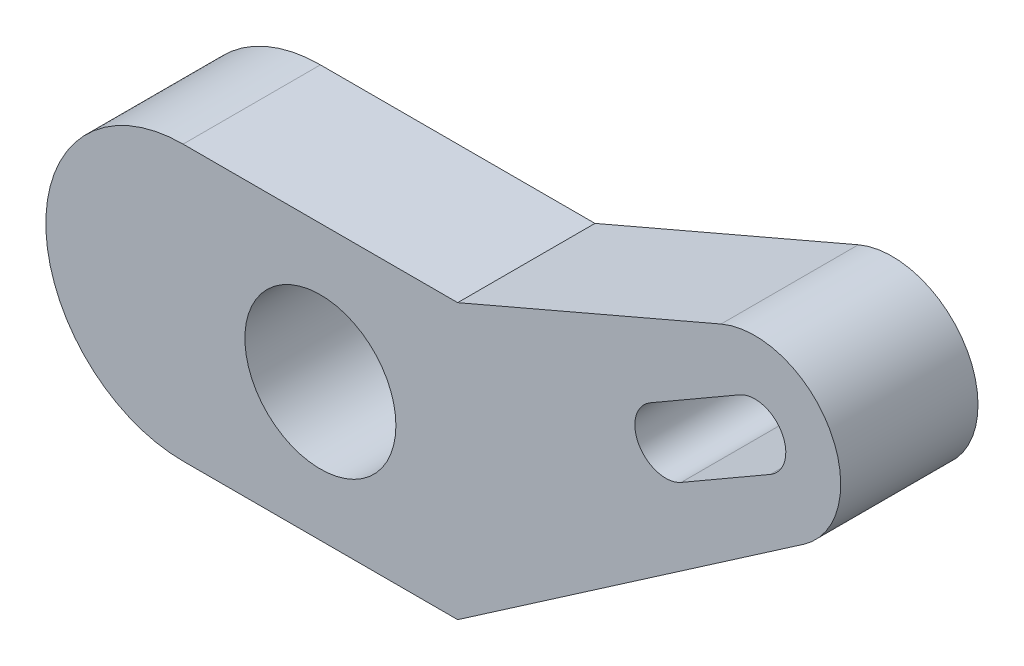
ISO-10303-21;
HEADER;
FILE_DESCRIPTION(('STEP AP214'),'2;1');
FILE_NAME('part.step','',(''),(''),'','','');
FILE_SCHEMA(('AUTOMOTIVE_DESIGN { 1 0 10303 214 1 1 1 1 }'));
ENDSEC;
DATA;
#1=APPLICATION_CONTEXT('core data for automotive mechanical design processes');
#2=APPLICATION_PROTOCOL_DEFINITION('international standard','automotive_design',2000,#1);
#3=PRODUCT_CONTEXT('',#1,'mechanical');
#4=PRODUCT('Part','Part','',(#3));
#5=PRODUCT_RELATED_PRODUCT_CATEGORY('part','',(#4));
#6=PRODUCT_DEFINITION_FORMATION('','',#4);
#7=PRODUCT_DEFINITION_CONTEXT('part definition',#1,'design');
#8=PRODUCT_DEFINITION('design','',#6,#7);
#9=PRODUCT_DEFINITION_SHAPE('','',#8);
#10=(LENGTH_UNIT() NAMED_UNIT(*) SI_UNIT(.MILLI.,.METRE.));
#11=(NAMED_UNIT(*) PLANE_ANGLE_UNIT() SI_UNIT($,.RADIAN.));
#12=(NAMED_UNIT(*) SI_UNIT($,.STERADIAN.) SOLID_ANGLE_UNIT());
#13=UNCERTAINTY_MEASURE_WITH_UNIT(LENGTH_MEASURE(1.E-05),#10,'distance_accuracy_value','');
#14=(GEOMETRIC_REPRESENTATION_CONTEXT(3) GLOBAL_UNCERTAINTY_ASSIGNED_CONTEXT((#13)) GLOBAL_UNIT_ASSIGNED_CONTEXT((#10,
#11,#12)) REPRESENTATION_CONTEXT('',''));
#15=CARTESIAN_POINT('',(0.,0.,0.));
#16=DIRECTION('',(0.,0.,1.));
#17=DIRECTION('',(1.,0.,0.));
#18=AXIS2_PLACEMENT_3D('',#15,#16,#17);
#19=CARTESIAN_POINT('',(0.,20.,20.));
#20=DIRECTION('',(0.,1.,0.));
#21=DIRECTION('',(-1.,0.,0.));
#22=AXIS2_PLACEMENT_3D('',#19,#20,#21);
#23=PLANE('',#22);
#24=DIRECTION('',(1.,0.,0.));
#25=VECTOR('',#24,1.);
#26=CARTESIAN_POINT('',(0.,20.,0.));
#27=LINE('',#26,#25);
#28=CARTESIAN_POINT('',(0.,20.,0.));
#29=VERTEX_POINT('',#28);
#30=CARTESIAN_POINT('',(40.,20.,0.));
#31=VERTEX_POINT('',#30);
#32=EDGE_CURVE('E176',#29,#31,#27,.T.);
#33=ORIENTED_EDGE('',*,*,#32,.F.);
#34=DIRECTION('',(0.,0.,-1.));
#35=VECTOR('',#34,1.);
#36=CARTESIAN_POINT('',(0.,20.,20.));
#37=LINE('',#36,#35);
#38=CARTESIAN_POINT('',(0.,20.,20.));
#39=VERTEX_POINT('',#38);
#40=EDGE_CURVE('E44',#39,#29,#37,.T.);
#41=ORIENTED_EDGE('',*,*,#40,.F.);
#42=DIRECTION('',(1.,0.,0.));
#43=VECTOR('',#42,1.);
#44=CARTESIAN_POINT('',(0.,20.,20.));
#45=LINE('',#44,#43);
#46=CARTESIAN_POINT('',(40.,20.,20.));
#47=VERTEX_POINT('',#46);
#48=EDGE_CURVE('E177',#39,#47,#45,.T.);
#49=ORIENTED_EDGE('',*,*,#48,.T.);
#50=DIRECTION('',(0.,0.,-1.));
#51=VECTOR('',#50,1.);
#52=CARTESIAN_POINT('',(40.,20.,20.));
#53=LINE('',#52,#51);
#54=EDGE_CURVE('E11',#47,#31,#53,.T.);
#55=ORIENTED_EDGE('',*,*,#54,.T.);
#56=EDGE_LOOP('',(#33,#41,#49,#55));
#57=FACE_BOUND('',#56,.T.);
#58=ADVANCED_FACE('F37',(#57),#23,.T.);
#59=CARTESIAN_POINT('',(0.,0.,20.));
#60=DIRECTION('',(0.,0.,-1.));
#61=DIRECTION('',(-1.,0.,0.));
#62=AXIS2_PLACEMENT_3D('',#59,#60,#61);
#63=CYLINDRICAL_SURFACE('',#62,20.);
#64=CARTESIAN_POINT('',(0.,0.,0.));
#65=DIRECTION('',(0.,0.,1.));
#66=DIRECTION('',(1.,0.,0.));
#67=AXIS2_PLACEMENT_3D('',#64,#65,#66);
#68=CIRCLE('',#67,20.);
#69=CARTESIAN_POINT('',(0.,-20.,0.));
#70=VERTEX_POINT('',#69);
#71=EDGE_CURVE('E187',#29,#70,#68,.T.);
#72=ORIENTED_EDGE('',*,*,#71,.T.);
#73=DIRECTION('',(0.,0.,-1.));
#74=VECTOR('',#73,1.);
#75=CARTESIAN_POINT('',(0.,-20.,20.));
#76=LINE('',#75,#74);
#77=CARTESIAN_POINT('',(0.,-20.,20.));
#78=VERTEX_POINT('',#77);
#79=EDGE_CURVE('E192',#78,#70,#76,.T.);
#80=ORIENTED_EDGE('',*,*,#79,.F.);
#81=CARTESIAN_POINT('',(0.,0.,20.));
#82=DIRECTION('',(0.,0.,1.));
#83=DIRECTION('',(1.,0.,0.));
#84=AXIS2_PLACEMENT_3D('',#81,#82,#83);
#85=CIRCLE('',#84,20.);
#86=EDGE_CURVE('E179',#39,#78,#85,.T.);
#87=ORIENTED_EDGE('',*,*,#86,.F.);
#88=ORIENTED_EDGE('',*,*,#40,.T.);
#89=EDGE_LOOP('',(#72,#80,#87,#88));
#90=FACE_BOUND('',#89,.T.);
#91=ADVANCED_FACE('F197',(#90),#63,.T.);
#92=CARTESIAN_POINT('',(0.,-20.,20.));
#93=DIRECTION('',(0.,1.,0.));
#94=DIRECTION('',(-1.,0.,0.));
#95=AXIS2_PLACEMENT_3D('',#92,#93,#94);
#96=PLANE('',#95);
#97=DIRECTION('',(1.,0.,0.));
#98=VECTOR('',#97,1.);
#99=CARTESIAN_POINT('',(0.,-20.,0.));
#100=LINE('',#99,#98);
#101=CARTESIAN_POINT('',(40.,-20.,0.));
#102=VERTEX_POINT('',#101);
#103=EDGE_CURVE('E180',#70,#102,#100,.T.);
#104=ORIENTED_EDGE('',*,*,#103,.T.);
#105=DIRECTION('',(0.,0.,-1.));
#106=VECTOR('',#105,1.);
#107=CARTESIAN_POINT('',(40.,-20.,20.));
#108=LINE('',#107,#106);
#109=CARTESIAN_POINT('',(40.,-20.,20.));
#110=VERTEX_POINT('',#109);
#111=EDGE_CURVE('E184',#110,#102,#108,.T.);
#112=ORIENTED_EDGE('',*,*,#111,.F.);
#113=DIRECTION('',(1.,0.,0.));
#114=VECTOR('',#113,1.);
#115=CARTESIAN_POINT('',(0.,-20.,20.));
#116=LINE('',#115,#114);
#117=EDGE_CURVE('E182',#78,#110,#116,.T.);
#118=ORIENTED_EDGE('',*,*,#117,.F.);
#119=ORIENTED_EDGE('',*,*,#79,.T.);
#120=EDGE_LOOP('',(#104,#112,#118,#119));
#121=FACE_BOUND('',#120,.T.);
#122=ADVANCED_FACE('F220',(#121),#96,.F.);
#123=CARTESIAN_POINT('',(0.,0.,20.));
#124=DIRECTION('',(0.,0.,1.));
#125=DIRECTION('',(1.,0.,0.));
#126=AXIS2_PLACEMENT_3D('',#123,#124,#125);
#127=PLANE('',#126);
#128=DIRECTION('',(-0.866025403784438,-0.500000000000002,0.));
#129=VECTOR('',#128,1.);
#130=CARTESIAN_POINT('',(7.75000000000006,-13.4233937586589,20.));
#131=LINE('',#130,#129);
#132=CARTESIAN_POINT('',(81.0512701892219,28.89711431703,20.));
#133=VERTEX_POINT('',#132);
#134=CARTESIAN_POINT('',(68.0608891324553,21.39711431703,20.));
#135=VERTEX_POINT('',#134);
#136=EDGE_CURVE('E51',#133,#135,#131,.T.);
#137=ORIENTED_EDGE('',*,*,#136,.F.);
#138=CARTESIAN_POINT('',(83.3012701892219,25.0000000000001,20.));
#139=DIRECTION('',(0.,0.,1.));
#140=DIRECTION('',(1.,0.,0.));
#141=AXIS2_PLACEMENT_3D('',#138,#139,#140);
#142=CIRCLE('',#141,4.5);
#143=CARTESIAN_POINT('',(85.5512701892219,21.1028856829701,20.));
#144=VERTEX_POINT('',#143);
#145=EDGE_CURVE('E130',#144,#133,#142,.T.);
#146=ORIENTED_EDGE('',*,*,#145,.F.);
#147=DIRECTION('',(0.866025403784438,0.5,0.));
#148=VECTOR('',#147,1.);
#149=CARTESIAN_POINT('',(12.25,-21.2176223927187,20.));
#150=LINE('',#149,#148);
#151=CARTESIAN_POINT('',(72.5608891324553,13.6028856829701,20.));
#152=VERTEX_POINT('',#151);
#153=EDGE_CURVE('E133',#152,#144,#150,.T.);
#154=ORIENTED_EDGE('',*,*,#153,.F.);
#155=CARTESIAN_POINT('',(70.3108891324553,17.5000000000001,20.));
#156=DIRECTION('',(0.,0.,1.));
#157=DIRECTION('',(1.,0.,0.));
#158=AXIS2_PLACEMENT_3D('',#155,#156,#157);
#159=CIRCLE('',#158,4.5);
#160=EDGE_CURVE('E139',#135,#152,#159,.T.);
#161=ORIENTED_EDGE('',*,*,#160,.F.);
#162=EDGE_LOOP('',(#137,#146,#154,#161));
#163=FACE_BOUND('',#162,.T.);
#164=CARTESIAN_POINT('',(20.,0.,20.));
#165=DIRECTION('',(0.,0.,1.));
#166=DIRECTION('',(1.,0.,0.));
#167=AXIS2_PLACEMENT_3D('',#164,#165,#166);
#168=CIRCLE('',#167,11.);
#169=CARTESIAN_POINT('',(31.,0.,20.));
#170=VERTEX_POINT('',#169);
#171=EDGE_CURVE('E145',#170,#170,#168,.T.);
#172=ORIENTED_EDGE('',*,*,#171,.F.);
#173=EDGE_LOOP('',(#172));
#174=FACE_BOUND('',#173,.T.);
#175=ORIENTED_EDGE('',*,*,#117,.T.);
#176=DIRECTION('',(0.823574307507263,0.56720839205175,0.));
#177=VECTOR('',#176,1.);
#178=CARTESIAN_POINT('',(22.2117795744838,-32.2510231475745,20.));
#179=LINE('',#178,#177);
#180=CARTESIAN_POINT('',(90.3913750898688,14.7053211561593,20.));
#181=VERTEX_POINT('',#180);
#182=EDGE_CURVE('E155',#110,#181,#179,.T.);
#183=ORIENTED_EDGE('',*,*,#182,.T.);
#184=CARTESIAN_POINT('',(83.3012701892219,25.0000000000001,20.));
#185=DIRECTION('',(0.,0.,1.));
#186=DIRECTION('',(1.,0.,0.));
#187=AXIS2_PLACEMENT_3D('',#184,#185,#186);
#188=CIRCLE('',#187,12.5);
#189=CARTESIAN_POINT('',(78.3666843933574,36.4847665637249,20.));
#190=VERTEX_POINT('',#189);
#191=EDGE_CURVE('E158',#181,#190,#188,.T.);
#192=ORIENTED_EDGE('',*,*,#191,.T.);
#193=DIRECTION('',(-0.918781325097988,-0.394766863669159,0.));
#194=VECTOR('',#193,1.);
#195=CARTESIAN_POINT('',(-1.02045337608716,2.37500558270723,20.));
#196=LINE('',#195,#194);
#197=EDGE_CURVE('E161',#190,#47,#196,.T.);
#198=ORIENTED_EDGE('',*,*,#197,.T.);
#199=ORIENTED_EDGE('',*,*,#48,.F.);
#200=ORIENTED_EDGE('',*,*,#86,.T.);
#201=EDGE_LOOP('',(#175,#183,#192,#198,#199,#200));
#202=FACE_BOUND('',#201,.T.);
#203=ADVANCED_FACE('F222',(#163,#174,#202),#127,.T.);
#204=CARTESIAN_POINT('',(0.,0.,0.));
#205=DIRECTION('',(0.,0.,1.));
#206=DIRECTION('',(1.,0.,0.));
#207=AXIS2_PLACEMENT_3D('',#204,#205,#206);
#208=PLANE('',#207);
#209=CARTESIAN_POINT('',(83.3012701892219,25.0000000000001,0.));
#210=DIRECTION('',(0.,0.,1.));
#211=DIRECTION('',(1.,0.,0.));
#212=AXIS2_PLACEMENT_3D('',#209,#210,#211);
#213=CIRCLE('',#212,4.5);
#214=CARTESIAN_POINT('',(85.5512701892219,21.1028856829701,0.));
#215=VERTEX_POINT('',#214);
#216=CARTESIAN_POINT('',(81.0512701892219,28.89711431703,0.));
#217=VERTEX_POINT('',#216);
#218=EDGE_CURVE('E120',#215,#217,#213,.T.);
#219=ORIENTED_EDGE('',*,*,#218,.T.);
#220=DIRECTION('',(-0.866025403784438,-0.500000000000002,0.));
#221=VECTOR('',#220,1.);
#222=CARTESIAN_POINT('',(7.75000000000006,-13.4233937586589,0.));
#223=LINE('',#222,#221);
#224=CARTESIAN_POINT('',(68.0608891324553,21.39711431703,0.));
#225=VERTEX_POINT('',#224);
#226=EDGE_CURVE('E114',#217,#225,#223,.T.);
#227=ORIENTED_EDGE('',*,*,#226,.T.);
#228=CARTESIAN_POINT('',(70.3108891324553,17.5000000000001,0.));
#229=DIRECTION('',(0.,0.,1.));
#230=DIRECTION('',(1.,0.,0.));
#231=AXIS2_PLACEMENT_3D('',#228,#229,#230);
#232=CIRCLE('',#231,4.5);
#233=CARTESIAN_POINT('',(72.5608891324553,13.6028856829701,0.));
#234=VERTEX_POINT('',#233);
#235=EDGE_CURVE('E123',#225,#234,#232,.T.);
#236=ORIENTED_EDGE('',*,*,#235,.T.);
#237=DIRECTION('',(0.866025403784438,0.5,0.));
#238=VECTOR('',#237,1.);
#239=CARTESIAN_POINT('',(12.25,-21.2176223927187,0.));
#240=LINE('',#239,#238);
#241=EDGE_CURVE('E59',#234,#215,#240,.T.);
#242=ORIENTED_EDGE('',*,*,#241,.T.);
#243=EDGE_LOOP('',(#219,#227,#236,#242));
#244=FACE_BOUND('',#243,.T.);
#245=CARTESIAN_POINT('',(20.,0.,0.));
#246=DIRECTION('',(0.,0.,1.));
#247=DIRECTION('',(1.,0.,0.));
#248=AXIS2_PLACEMENT_3D('',#245,#246,#247);
#249=CIRCLE('',#248,11.);
#250=CARTESIAN_POINT('',(31.,0.,0.));
#251=VERTEX_POINT('',#250);
#252=EDGE_CURVE('E149',#251,#251,#249,.T.);
#253=ORIENTED_EDGE('',*,*,#252,.T.);
#254=EDGE_LOOP('',(#253));
#255=FACE_BOUND('',#254,.T.);
#256=ORIENTED_EDGE('',*,*,#32,.T.);
#257=DIRECTION('',(-0.918781325097988,-0.394766863669159,0.));
#258=VECTOR('',#257,1.);
#259=CARTESIAN_POINT('',(-1.02045337608716,2.37500558270723,0.));
#260=LINE('',#259,#258);
#261=CARTESIAN_POINT('',(78.3666843933574,36.4847665637249,0.));
#262=VERTEX_POINT('',#261);
#263=EDGE_CURVE('E159',#262,#31,#260,.T.);
#264=ORIENTED_EDGE('',*,*,#263,.F.);
#265=CARTESIAN_POINT('',(83.3012701892219,25.0000000000001,0.));
#266=DIRECTION('',(0.,0.,1.));
#267=DIRECTION('',(1.,0.,0.));
#268=AXIS2_PLACEMENT_3D('',#265,#266,#267);
#269=CIRCLE('',#268,12.5);
#270=CARTESIAN_POINT('',(90.3913750898688,14.7053211561593,0.));
#271=VERTEX_POINT('',#270);
#272=EDGE_CURVE('E167',#271,#262,#269,.T.);
#273=ORIENTED_EDGE('',*,*,#272,.F.);
#274=DIRECTION('',(0.823574307507263,0.56720839205175,0.));
#275=VECTOR('',#274,1.);
#276=CARTESIAN_POINT('',(22.2117795744838,-32.2510231475745,0.));
#277=LINE('',#276,#275);
#278=EDGE_CURVE('E152',#102,#271,#277,.T.);
#279=ORIENTED_EDGE('',*,*,#278,.F.);
#280=ORIENTED_EDGE('',*,*,#103,.F.);
#281=ORIENTED_EDGE('',*,*,#71,.F.);
#282=EDGE_LOOP('',(#256,#264,#273,#279,#280,#281));
#283=FACE_BOUND('',#282,.T.);
#284=ADVANCED_FACE('F127',(#244,#255,#283),#208,.F.);
#285=CARTESIAN_POINT('',(22.2117795744838,-32.2510231475745,20.));
#286=DIRECTION('',(-0.56720839205175,0.823574307507263,0.));
#287=DIRECTION('',(-0.823574307507263,-0.56720839205175,0.));
#288=AXIS2_PLACEMENT_3D('',#285,#286,#287);
#289=PLANE('',#288);
#290=ORIENTED_EDGE('',*,*,#278,.T.);
#291=DIRECTION('',(0.,0.,-1.));
#292=VECTOR('',#291,1.);
#293=CARTESIAN_POINT('',(90.3913750898688,14.7053211561593,20.));
#294=LINE('',#293,#292);
#295=EDGE_CURVE('E173',#181,#271,#294,.T.);
#296=ORIENTED_EDGE('',*,*,#295,.F.);
#297=ORIENTED_EDGE('',*,*,#182,.F.);
#298=ORIENTED_EDGE('',*,*,#111,.T.);
#299=EDGE_LOOP('',(#290,#296,#297,#298));
#300=FACE_BOUND('',#299,.T.);
#301=ADVANCED_FACE('F216',(#300),#289,.F.);
#302=CARTESIAN_POINT('',(83.3012701892219,25.0000000000001,20.));
#303=DIRECTION('',(0.,0.,-1.));
#304=DIRECTION('',(-1.,0.,0.));
#305=AXIS2_PLACEMENT_3D('',#302,#303,#304);
#306=CYLINDRICAL_SURFACE('',#305,12.5);
#307=ORIENTED_EDGE('',*,*,#272,.T.);
#308=DIRECTION('',(0.,0.,-1.));
#309=VECTOR('',#308,1.);
#310=CARTESIAN_POINT('',(78.3666843933574,36.4847665637249,20.));
#311=LINE('',#310,#309);
#312=EDGE_CURVE('E164',#190,#262,#311,.T.);
#313=ORIENTED_EDGE('',*,*,#312,.F.);
#314=ORIENTED_EDGE('',*,*,#191,.F.);
#315=ORIENTED_EDGE('',*,*,#295,.T.);
#316=EDGE_LOOP('',(#307,#313,#314,#315));
#317=FACE_BOUND('',#316,.T.);
#318=ADVANCED_FACE('F213',(#317),#306,.T.);
#319=CARTESIAN_POINT('',(-1.02045337608716,2.37500558270723,20.));
#320=DIRECTION('',(0.394766863669159,-0.918781325097988,0.));
#321=DIRECTION('',(0.918781325097988,0.394766863669159,0.));
#322=AXIS2_PLACEMENT_3D('',#319,#320,#321);
#323=PLANE('',#322);
#324=ORIENTED_EDGE('',*,*,#263,.T.);
#325=ORIENTED_EDGE('',*,*,#54,.F.);
#326=ORIENTED_EDGE('',*,*,#197,.F.);
#327=ORIENTED_EDGE('',*,*,#312,.T.);
#328=EDGE_LOOP('',(#324,#325,#326,#327));
#329=FACE_BOUND('',#328,.T.);
#330=ADVANCED_FACE('F209',(#329),#323,.F.);
#331=CARTESIAN_POINT('',(20.,0.,0.));
#332=DIRECTION('',(0.,0.,1.));
#333=DIRECTION('',(1.,0.,0.));
#334=AXIS2_PLACEMENT_3D('',#331,#332,#333);
#335=CYLINDRICAL_SURFACE('',#334,11.);
#336=ORIENTED_EDGE('',*,*,#252,.F.);
#337=EDGE_LOOP('',(#336));
#338=FACE_BOUND('',#337,.T.);
#339=ORIENTED_EDGE('',*,*,#171,.T.);
#340=EDGE_LOOP('',(#339));
#341=FACE_BOUND('',#340,.T.);
#342=ADVANCED_FACE('F271',(#338,#341),#335,.F.);
#343=CARTESIAN_POINT('',(7.75000000000006,-13.4233937586589,0.));
#344=DIRECTION('',(-0.500000000000002,0.866025403784438,0.));
#345=DIRECTION('',(-0.866025403784438,-0.500000000000002,0.));
#346=AXIS2_PLACEMENT_3D('',#343,#344,#345);
#347=PLANE('',#346);
#348=ORIENTED_EDGE('',*,*,#136,.T.);
#349=DIRECTION('',(0.,0.,1.));
#350=VECTOR('',#349,1.);
#351=CARTESIAN_POINT('',(68.0608891324553,21.39711431703,0.));
#352=LINE('',#351,#350);
#353=EDGE_CURVE('E110',#225,#135,#352,.T.);
#354=ORIENTED_EDGE('',*,*,#353,.F.);
#355=ORIENTED_EDGE('',*,*,#226,.F.);
#356=DIRECTION('',(0.,0.,1.));
#357=VECTOR('',#356,1.);
#358=CARTESIAN_POINT('',(81.0512701892219,28.89711431703,0.));
#359=LINE('',#358,#357);
#360=EDGE_CURVE('E143',#217,#133,#359,.T.);
#361=ORIENTED_EDGE('',*,*,#360,.T.);
#362=EDGE_LOOP('',(#348,#354,#355,#361));
#363=FACE_BOUND('',#362,.T.);
#364=ADVANCED_FACE('F112',(#363),#347,.F.);
#365=CARTESIAN_POINT('',(83.3012701892219,25.0000000000001,0.));
#366=DIRECTION('',(0.,0.,1.));
#367=DIRECTION('',(1.,0.,0.));
#368=AXIS2_PLACEMENT_3D('',#365,#366,#367);
#369=CYLINDRICAL_SURFACE('',#368,4.5);
#370=ORIENTED_EDGE('',*,*,#145,.T.);
#371=ORIENTED_EDGE('',*,*,#360,.F.);
#372=ORIENTED_EDGE('',*,*,#218,.F.);
#373=DIRECTION('',(0.,0.,1.));
#374=VECTOR('',#373,1.);
#375=CARTESIAN_POINT('',(85.5512701892219,21.1028856829701,0.));
#376=LINE('',#375,#374);
#377=EDGE_CURVE('E146',#215,#144,#376,.T.);
#378=ORIENTED_EDGE('',*,*,#377,.T.);
#379=EDGE_LOOP('',(#370,#371,#372,#378));
#380=FACE_BOUND('',#379,.T.);
#381=ADVANCED_FACE('F301',(#380),#369,.F.);
#382=CARTESIAN_POINT('',(12.25,-21.2176223927187,0.));
#383=DIRECTION('',(0.5,-0.866025403784438,0.));
#384=DIRECTION('',(0.866025403784438,0.5,0.));
#385=AXIS2_PLACEMENT_3D('',#382,#383,#384);
#386=PLANE('',#385);
#387=ORIENTED_EDGE('',*,*,#153,.T.);
#388=ORIENTED_EDGE('',*,*,#377,.F.);
#389=ORIENTED_EDGE('',*,*,#241,.F.);
#390=DIRECTION('',(0.,0.,1.));
#391=VECTOR('',#390,1.);
#392=CARTESIAN_POINT('',(72.5608891324553,13.6028856829701,0.));
#393=LINE('',#392,#391);
#394=EDGE_CURVE('E119',#234,#152,#393,.T.);
#395=ORIENTED_EDGE('',*,*,#394,.T.);
#396=EDGE_LOOP('',(#387,#388,#389,#395));
#397=FACE_BOUND('',#396,.T.);
#398=ADVANCED_FACE('F310',(#397),#386,.F.);
#399=CARTESIAN_POINT('',(70.3108891324553,17.5000000000001,0.));
#400=DIRECTION('',(0.,0.,1.));
#401=DIRECTION('',(1.,0.,0.));
#402=AXIS2_PLACEMENT_3D('',#399,#400,#401);
#403=CYLINDRICAL_SURFACE('',#402,4.5);
#404=ORIENTED_EDGE('',*,*,#160,.T.);
#405=ORIENTED_EDGE('',*,*,#394,.F.);
#406=ORIENTED_EDGE('',*,*,#235,.F.);
#407=ORIENTED_EDGE('',*,*,#353,.T.);
#408=EDGE_LOOP('',(#404,#405,#406,#407));
#409=FACE_BOUND('',#408,.T.);
#410=ADVANCED_FACE('F124',(#409),#403,.F.);
#411=CLOSED_SHELL('',(#58,#91,#122,#203,#284,#301,#318,#330,#342,#364,#381,#398,#410));
#412=MANIFOLD_SOLID_BREP('B2',#411);
#413=ADVANCED_BREP_SHAPE_REPRESENTATION('',(#18,#412),#14);
#414=SHAPE_DEFINITION_REPRESENTATION(#9,#413);
ENDSEC;
END-ISO-10303-21;
